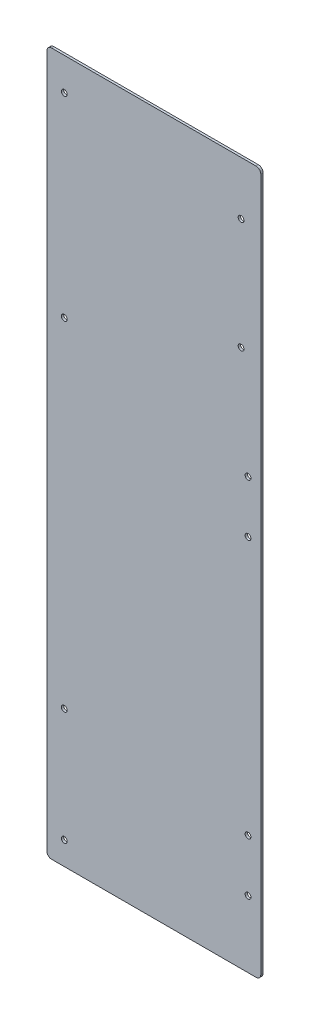
ISO-10303-21;
HEADER;
FILE_DESCRIPTION(('STEP AP214'),'2;1');
FILE_NAME('part.step','',(''),(''),'','','');
FILE_SCHEMA(('AUTOMOTIVE_DESIGN { 1 0 10303 214 1 1 1 1 }'));
ENDSEC;
DATA;
#1=APPLICATION_CONTEXT('core data for automotive mechanical design processes');
#2=APPLICATION_PROTOCOL_DEFINITION('international standard','automotive_design',2000,#1);
#3=PRODUCT_CONTEXT('',#1,'mechanical');
#4=PRODUCT('Part','Part','',(#3));
#5=PRODUCT_RELATED_PRODUCT_CATEGORY('part','',(#4));
#6=PRODUCT_DEFINITION_FORMATION('','',#4);
#7=PRODUCT_DEFINITION_CONTEXT('part definition',#1,'design');
#8=PRODUCT_DEFINITION('design','',#6,#7);
#9=PRODUCT_DEFINITION_SHAPE('','',#8);
#10=(LENGTH_UNIT() NAMED_UNIT(*) SI_UNIT(.MILLI.,.METRE.));
#11=(NAMED_UNIT(*) PLANE_ANGLE_UNIT() SI_UNIT($,.RADIAN.));
#12=(NAMED_UNIT(*) SI_UNIT($,.STERADIAN.) SOLID_ANGLE_UNIT());
#13=UNCERTAINTY_MEASURE_WITH_UNIT(LENGTH_MEASURE(1.E-05),#10,'distance_accuracy_value','');
#14=(GEOMETRIC_REPRESENTATION_CONTEXT(3) GLOBAL_UNCERTAINTY_ASSIGNED_CONTEXT((#13)) GLOBAL_UNIT_ASSIGNED_CONTEXT((#10,
#11,#12)) REPRESENTATION_CONTEXT('',''));
#15=CARTESIAN_POINT('',(0.,0.,0.));
#16=DIRECTION('',(0.,0.,1.));
#17=DIRECTION('',(1.,0.,0.));
#18=AXIS2_PLACEMENT_3D('',#15,#16,#17);
#19=CARTESIAN_POINT('',(20.1603943953535,303.,-0.9999999999998));
#20=DIRECTION('',(0.,1.,0.));
#21=DIRECTION('',(1.,0.,0.));
#22=AXIS2_PLACEMENT_3D('',#19,#20,#21);
#23=PLANE('',#22);
#24=DIRECTION('',(-1.,0.,0.));
#25=VECTOR('',#24,1.);
#26=CARTESIAN_POINT('',(20.1603943953535,303.,-0.9999999999998));
#27=LINE('',#26,#25);
#28=CARTESIAN_POINT('',(71.694686130642,303.,-1.00000000000026));
#29=VERTEX_POINT('',#28);
#30=CARTESIAN_POINT('',(-16.5342917352885,303.,-1.00000000000009));
#31=VERTEX_POINT('',#30);
#32=EDGE_CURVE('E13',#29,#31,#27,.T.);
#33=ORIENTED_EDGE('',*,*,#32,.T.);
#34=DIRECTION('',(0.,0.,1.));
#35=VECTOR('',#34,1.);
#36=CARTESIAN_POINT('',(-16.5342917352885,303.,-1.00000000000009));
#37=LINE('',#36,#35);
#38=CARTESIAN_POINT('',(-16.5342917352885,303.,0.));
#39=VERTEX_POINT('',#38);
#40=EDGE_CURVE('E312',#31,#39,#37,.T.);
#41=ORIENTED_EDGE('',*,*,#40,.T.);
#42=DIRECTION('',(1.,0.,0.));
#43=VECTOR('',#42,1.);
#44=CARTESIAN_POINT('',(20.1603943953535,303.,2.0122792321331E-13));
#45=LINE('',#44,#43);
#46=CARTESIAN_POINT('',(71.694686130642,303.,-2.63677968348475E-13));
#47=VERTEX_POINT('',#46);
#48=EDGE_CURVE('E181',#47,#39,#45,.F.);
#49=ORIENTED_EDGE('',*,*,#48,.F.);
#50=DIRECTION('',(0.,0.,1.));
#51=VECTOR('',#50,1.);
#52=CARTESIAN_POINT('',(71.694686130642,303.,-1.00000000000026));
#53=LINE('',#52,#51);
#54=EDGE_CURVE('E224',#47,#29,#53,.F.);
#55=ORIENTED_EDGE('',*,*,#54,.T.);
#56=EDGE_LOOP('',(#33,#41,#49,#55));
#57=FACE_BOUND('',#56,.T.);
#58=ADVANCED_FACE('F109',(#57),#23,.T.);
#59=CARTESIAN_POINT('',(55.1603943953535,0.,-1.00000000000004));
#60=DIRECTION('',(0.,-1.,0.));
#61=DIRECTION('',(-1.,0.,0.));
#62=AXIS2_PLACEMENT_3D('',#59,#60,#61);
#63=PLANE('',#62);
#64=DIRECTION('',(-1.,0.,0.));
#65=VECTOR('',#64,1.);
#66=CARTESIAN_POINT('',(20.1603943953535,0.,2.0122792321331E-13));
#67=LINE('',#66,#65);
#68=CARTESIAN_POINT('',(-16.5342917352885,0.,0.));
#69=VERTEX_POINT('',#68);
#70=CARTESIAN_POINT('',(71.694686130642,0.,-2.63677968348475E-13));
#71=VERTEX_POINT('',#70);
#72=EDGE_CURVE('E113',#69,#71,#67,.F.);
#73=ORIENTED_EDGE('',*,*,#72,.F.);
#74=DIRECTION('',(0.,0.,1.));
#75=VECTOR('',#74,1.);
#76=CARTESIAN_POINT('',(-16.5342917352885,0.,-1.00000000000009));
#77=LINE('',#76,#75);
#78=CARTESIAN_POINT('',(-16.5342917352885,0.,-1.00000000000009));
#79=VERTEX_POINT('',#78);
#80=EDGE_CURVE('E192',#69,#79,#77,.F.);
#81=ORIENTED_EDGE('',*,*,#80,.T.);
#82=DIRECTION('',(1.,0.,0.));
#83=VECTOR('',#82,1.);
#84=CARTESIAN_POINT('',(55.1603943953535,0.,-1.00000000000004));
#85=LINE('',#84,#83);
#86=CARTESIAN_POINT('',(71.694686130642,0.,-1.00000000000026));
#87=VERTEX_POINT('',#86);
#88=EDGE_CURVE('E120',#79,#87,#85,.T.);
#89=ORIENTED_EDGE('',*,*,#88,.T.);
#90=DIRECTION('',(0.,0.,1.));
#91=VECTOR('',#90,1.);
#92=CARTESIAN_POINT('',(71.694686130642,0.,-1.00000000000026));
#93=LINE('',#92,#91);
#94=EDGE_CURVE('E215',#87,#71,#93,.T.);
#95=ORIENTED_EDGE('',*,*,#94,.T.);
#96=EDGE_LOOP('',(#73,#81,#89,#95));
#97=FACE_BOUND('',#96,.T.);
#98=ADVANCED_FACE('F368',(#97),#63,.T.);
#99=CARTESIAN_POINT('',(20.1603943953535,0.,-0.9999999999998));
#100=DIRECTION('',(0.,0.,-1.));
#101=DIRECTION('',(-1.,0.,0.));
#102=AXIS2_PLACEMENT_3D('',#99,#100,#101);
#103=PLANE('',#102);
#104=ORIENTED_EDGE('',*,*,#88,.F.);
#105=CARTESIAN_POINT('',(-16.5342917352885,2.,-1.00000000000009));
#106=DIRECTION('',(0.,0.,1.));
#107=DIRECTION('',(1.,0.,0.));
#108=AXIS2_PLACEMENT_3D('',#105,#106,#107);
#109=CIRCLE('',#108,2.);
#110=CARTESIAN_POINT('',(-18.5342917352885,2.,-1.00000000000011));
#111=VERTEX_POINT('',#110);
#112=EDGE_CURVE('E165',#79,#111,#109,.F.);
#113=ORIENTED_EDGE('',*,*,#112,.T.);
#114=DIRECTION('',(0.,1.,0.));
#115=VECTOR('',#114,1.);
#116=CARTESIAN_POINT('',(-18.5342917352885,0.,-1.00000000000011));
#117=LINE('',#116,#115);
#118=CARTESIAN_POINT('',(-18.5342917352885,301.,-1.00000000000011));
#119=VERTEX_POINT('',#118);
#120=EDGE_CURVE('E202',#111,#119,#117,.T.);
#121=ORIENTED_EDGE('',*,*,#120,.T.);
#122=CARTESIAN_POINT('',(-16.5342917352885,301.,-1.00000000000009));
#123=DIRECTION('',(0.,0.,1.));
#124=DIRECTION('',(1.,0.,0.));
#125=AXIS2_PLACEMENT_3D('',#122,#123,#124);
#126=CIRCLE('',#125,2.);
#127=EDGE_CURVE('E704',#119,#31,#126,.F.);
#128=ORIENTED_EDGE('',*,*,#127,.T.);
#129=ORIENTED_EDGE('',*,*,#32,.F.);
#130=CARTESIAN_POINT('',(71.694686130642,301.,-1.00000000000026));
#131=DIRECTION('',(0.,0.,1.));
#132=DIRECTION('',(1.,0.,0.));
#133=AXIS2_PLACEMENT_3D('',#130,#131,#132);
#134=CIRCLE('',#133,2.);
#135=CARTESIAN_POINT('',(73.694686130642,301.,-1.00000000000029));
#136=VERTEX_POINT('',#135);
#137=EDGE_CURVE('E235',#29,#136,#134,.F.);
#138=ORIENTED_EDGE('',*,*,#137,.T.);
#139=DIRECTION('',(0.,-1.,0.));
#140=VECTOR('',#139,1.);
#141=CARTESIAN_POINT('',(73.694686130642,0.,-1.00000000000029));
#142=LINE('',#141,#140);
#143=CARTESIAN_POINT('',(73.694686130642,2.,-1.00000000000029));
#144=VERTEX_POINT('',#143);
#145=EDGE_CURVE('E232',#136,#144,#142,.T.);
#146=ORIENTED_EDGE('',*,*,#145,.T.);
#147=CARTESIAN_POINT('',(71.694686130642,2.,-1.00000000000026));
#148=DIRECTION('',(0.,0.,1.));
#149=DIRECTION('',(1.,0.,0.));
#150=AXIS2_PLACEMENT_3D('',#147,#148,#149);
#151=CIRCLE('',#150,2.);
#152=EDGE_CURVE('E228',#144,#87,#151,.F.);
#153=ORIENTED_EDGE('',*,*,#152,.T.);
#154=EDGE_LOOP('',(#104,#113,#121,#128,#129,#138,#146,#153));
#155=FACE_BOUND('',#154,.T.);
#156=CARTESIAN_POINT('',(68.1946861306437,185.249999999993,-1.00000000000036));
#157=DIRECTION('',(0.,0.,-1.));
#158=DIRECTION('',(-1.,0.,0.));
#159=AXIS2_PLACEMENT_3D('',#156,#157,#158);
#160=CIRCLE('',#159,1.25000000000063);
#161=CARTESIAN_POINT('',(66.9446861306431,185.249999999993,-1.00000000000035));
#162=VERTEX_POINT('',#161);
#163=EDGE_CURVE('E238',#162,#162,#160,.T.);
#164=ORIENTED_EDGE('',*,*,#163,.F.);
#165=EDGE_LOOP('',(#164));
#166=FACE_BOUND('',#165,.T.);
#167=CARTESIAN_POINT('',(68.1946861306437,28.7499999999955,-1.00000000000036));
#168=DIRECTION('',(0.,0.,-1.));
#169=DIRECTION('',(-1.,0.,0.));
#170=AXIS2_PLACEMENT_3D('',#167,#168,#169);
#171=CIRCLE('',#170,1.25000000000093);
#172=CARTESIAN_POINT('',(66.9446861306428,28.7499999999955,-1.00000000000035));
#173=VERTEX_POINT('',#172);
#174=EDGE_CURVE('E246',#173,#173,#171,.T.);
#175=ORIENTED_EDGE('',*,*,#174,.F.);
#176=EDGE_LOOP('',(#175));
#177=FACE_BOUND('',#176,.T.);
#178=CARTESIAN_POINT('',(68.1946861306437,51.2499999999955,-1.00000000000036));
#179=DIRECTION('',(0.,0.,-1.));
#180=DIRECTION('',(-1.,0.,0.));
#181=AXIS2_PLACEMENT_3D('',#178,#179,#180);
#182=CIRCLE('',#181,1.25000000000093);
#183=CARTESIAN_POINT('',(66.9446861306428,51.2499999999955,-1.00000000000035));
#184=VERTEX_POINT('',#183);
#185=EDGE_CURVE('E254',#184,#184,#182,.T.);
#186=ORIENTED_EDGE('',*,*,#185,.F.);
#187=EDGE_LOOP('',(#186));
#188=FACE_BOUND('',#187,.T.);
#189=CARTESIAN_POINT('',(68.1946861306437,162.749999999993,-1.00000000000036));
#190=DIRECTION('',(0.,0.,-1.));
#191=DIRECTION('',(-1.,0.,0.));
#192=AXIS2_PLACEMENT_3D('',#189,#190,#191);
#193=CIRCLE('',#192,1.25000000000062);
#194=CARTESIAN_POINT('',(66.9446861306431,162.749999999993,-1.00000000000035));
#195=VERTEX_POINT('',#194);
#196=EDGE_CURVE('E262',#195,#195,#193,.T.);
#197=ORIENTED_EDGE('',*,*,#196,.F.);
#198=EDGE_LOOP('',(#197));
#199=FACE_BOUND('',#198,.T.);
#200=CARTESIAN_POINT('',(65.194686130642,231.999999999992,-1.00000000000034));
#201=DIRECTION('',(0.,0.,-1.));
#202=DIRECTION('',(-1.,0.,0.));
#203=AXIS2_PLACEMENT_3D('',#200,#201,#202);
#204=CIRCLE('',#203,1.25000000000003);
#205=CARTESIAN_POINT('',(63.944686130642,231.999999999992,-1.00000000000033));
#206=VERTEX_POINT('',#205);
#207=EDGE_CURVE('E270',#206,#206,#204,.T.);
#208=ORIENTED_EDGE('',*,*,#207,.F.);
#209=EDGE_LOOP('',(#208));
#210=FACE_BOUND('',#209,.T.);
#211=CARTESIAN_POINT('',(65.194686130642,279.999999999992,-1.00000000000034));
#212=DIRECTION('',(0.,0.,-1.));
#213=DIRECTION('',(-1.,0.,0.));
#214=AXIS2_PLACEMENT_3D('',#211,#212,#213);
#215=CIRCLE('',#214,1.25000000000003);
#216=CARTESIAN_POINT('',(63.944686130642,279.999999999992,-1.00000000000033));
#217=VERTEX_POINT('',#216);
#218=EDGE_CURVE('E278',#217,#217,#215,.T.);
#219=ORIENTED_EDGE('',*,*,#218,.F.);
#220=EDGE_LOOP('',(#219));
#221=FACE_BOUND('',#220,.T.);
#222=CARTESIAN_POINT('',(-11.0342917331599,204.999999999994,-1.00000000000005));
#223=DIRECTION('',(0.,0.,-1.));
#224=DIRECTION('',(-1.,0.,0.));
#225=AXIS2_PLACEMENT_3D('',#222,#223,#224);
#226=CIRCLE('',#225,1.25000000201031);
#227=CARTESIAN_POINT('',(-12.2842917351702,204.999999999994,-1.00000000000006));
#228=VERTEX_POINT('',#227);
#229=EDGE_CURVE('E315',#228,#228,#226,.T.);
#230=ORIENTED_EDGE('',*,*,#229,.F.);
#231=EDGE_LOOP('',(#230));
#232=FACE_BOUND('',#231,.T.);
#233=CARTESIAN_POINT('',(-11.0342917331599,58.9999999999939,-1.00000000000005));
#234=DIRECTION('',(0.,0.,-1.));
#235=DIRECTION('',(-1.,0.,0.));
#236=AXIS2_PLACEMENT_3D('',#233,#234,#235);
#237=CIRCLE('',#236,1.25000000201032);
#238=CARTESIAN_POINT('',(-12.2842917351703,58.9999999999939,-1.00000000000006));
#239=VERTEX_POINT('',#238);
#240=EDGE_CURVE('E330',#239,#239,#237,.T.);
#241=ORIENTED_EDGE('',*,*,#240,.F.);
#242=EDGE_LOOP('',(#241));
#243=FACE_BOUND('',#242,.T.);
#244=CARTESIAN_POINT('',(-11.0342917352785,9.99999999999573,-1.00000000000005));
#245=DIRECTION('',(0.,0.,-1.));
#246=DIRECTION('',(-1.,0.,0.));
#247=AXIS2_PLACEMENT_3D('',#244,#245,#246);
#248=CIRCLE('',#247,1.25000000000132);
#249=CARTESIAN_POINT('',(-12.2842917352798,9.99999999999573,-1.00000000000006));
#250=VERTEX_POINT('',#249);
#251=EDGE_CURVE('E338',#250,#250,#248,.T.);
#252=ORIENTED_EDGE('',*,*,#251,.F.);
#253=EDGE_LOOP('',(#252));
#254=FACE_BOUND('',#253,.T.);
#255=CARTESIAN_POINT('',(-11.0342917352785,288.999999999996,-1.00000000000005));
#256=DIRECTION('',(0.,0.,-1.));
#257=DIRECTION('',(-1.,0.,0.));
#258=AXIS2_PLACEMENT_3D('',#255,#256,#257);
#259=CIRCLE('',#258,1.25000000000133);
#260=CARTESIAN_POINT('',(-12.2842917352798,288.999999999996,-1.00000000000006));
#261=VERTEX_POINT('',#260);
#262=EDGE_CURVE('E346',#261,#261,#259,.T.);
#263=ORIENTED_EDGE('',*,*,#262,.F.);
#264=EDGE_LOOP('',(#263));
#265=FACE_BOUND('',#264,.T.);
#266=ADVANCED_FACE('F360',(#155,#166,#177,#188,#199,#210,#221,#232,#243,#254,#265),#103,.T.);
#267=CARTESIAN_POINT('',(0.,0.,0.));
#268=DIRECTION('',(0.,0.,-1.));
#269=DIRECTION('',(-1.,0.,0.));
#270=AXIS2_PLACEMENT_3D('',#267,#268,#269);
#271=PLANE('',#270);
#272=ORIENTED_EDGE('',*,*,#48,.T.);
#273=CARTESIAN_POINT('',(-16.5342917352885,301.,0.));
#274=DIRECTION('',(0.,0.,1.));
#275=DIRECTION('',(1.,0.,0.));
#276=AXIS2_PLACEMENT_3D('',#273,#274,#275);
#277=CIRCLE('',#276,2.);
#278=CARTESIAN_POINT('',(-18.5342917352885,301.,-1.04950770296597E-13));
#279=VERTEX_POINT('',#278);
#280=EDGE_CURVE('E195',#39,#279,#277,.T.);
#281=ORIENTED_EDGE('',*,*,#280,.T.);
#282=DIRECTION('',(0.,-1.,0.));
#283=VECTOR('',#282,1.);
#284=CARTESIAN_POINT('',(-18.5342917352885,303.,-1.04950770296597E-13));
#285=LINE('',#284,#283);
#286=CARTESIAN_POINT('',(-18.5342917352885,2.,-1.04950770296597E-13));
#287=VERTEX_POINT('',#286);
#288=EDGE_CURVE('E200',#287,#279,#285,.F.);
#289=ORIENTED_EDGE('',*,*,#288,.F.);
#290=CARTESIAN_POINT('',(-16.5342917352885,2.,0.));
#291=DIRECTION('',(0.,0.,1.));
#292=DIRECTION('',(1.,0.,0.));
#293=AXIS2_PLACEMENT_3D('',#290,#291,#292);
#294=CIRCLE('',#293,2.);
#295=EDGE_CURVE('E187',#287,#69,#294,.T.);
#296=ORIENTED_EDGE('',*,*,#295,.T.);
#297=ORIENTED_EDGE('',*,*,#72,.T.);
#298=CARTESIAN_POINT('',(71.694686130642,2.,-2.63677968348475E-13));
#299=DIRECTION('',(0.,0.,1.));
#300=DIRECTION('',(1.,0.,0.));
#301=AXIS2_PLACEMENT_3D('',#298,#299,#300);
#302=CIRCLE('',#301,2.);
#303=CARTESIAN_POINT('',(73.694686130642,2.,-2.91433543964104E-13));
#304=VERTEX_POINT('',#303);
#305=EDGE_CURVE('E129',#71,#304,#302,.T.);
#306=ORIENTED_EDGE('',*,*,#305,.T.);
#307=DIRECTION('',(0.,1.,0.));
#308=VECTOR('',#307,1.);
#309=CARTESIAN_POINT('',(73.694686130642,0.,-2.91433543964104E-13));
#310=LINE('',#309,#308);
#311=CARTESIAN_POINT('',(73.694686130642,301.,-2.91433543964104E-13));
#312=VERTEX_POINT('',#311);
#313=EDGE_CURVE('E288',#312,#304,#310,.F.);
#314=ORIENTED_EDGE('',*,*,#313,.F.);
#315=CARTESIAN_POINT('',(71.694686130642,301.,-2.63677968348475E-13));
#316=DIRECTION('',(0.,0.,1.));
#317=DIRECTION('',(1.,0.,0.));
#318=AXIS2_PLACEMENT_3D('',#315,#316,#317);
#319=CIRCLE('',#318,2.);
#320=EDGE_CURVE('E221',#312,#47,#319,.T.);
#321=ORIENTED_EDGE('',*,*,#320,.T.);
#322=EDGE_LOOP('',(#272,#281,#289,#296,#297,#306,#314,#321));
#323=FACE_BOUND('',#322,.T.);
#324=CARTESIAN_POINT('',(68.1946861306437,185.249999999993,-2.15105711021124E-13));
#325=DIRECTION('',(0.,0.,1.));
#326=DIRECTION('',(1.,0.,0.));
#327=AXIS2_PLACEMENT_3D('',#324,#325,#326);
#328=CIRCLE('',#327,1.25000000000063);
#329=CARTESIAN_POINT('',(69.4446861306443,185.249999999993,-2.32508031748125E-13));
#330=VERTEX_POINT('',#329);
#331=EDGE_CURVE('E242',#330,#330,#328,.T.);
#332=ORIENTED_EDGE('',*,*,#331,.F.);
#333=EDGE_LOOP('',(#332));
#334=FACE_BOUND('',#333,.T.);
#335=CARTESIAN_POINT('',(68.1946861306437,28.7499999999955,-2.15105711021124E-13));
#336=DIRECTION('',(0.,0.,1.));
#337=DIRECTION('',(1.,0.,0.));
#338=AXIS2_PLACEMENT_3D('',#335,#336,#337);
#339=CIRCLE('',#338,1.25000000000093);
#340=CARTESIAN_POINT('',(69.4446861306446,28.7499999999955,-2.32508031748129E-13));
#341=VERTEX_POINT('',#340);
#342=EDGE_CURVE('E250',#341,#341,#339,.T.);
#343=ORIENTED_EDGE('',*,*,#342,.F.);
#344=EDGE_LOOP('',(#343));
#345=FACE_BOUND('',#344,.T.);
#346=CARTESIAN_POINT('',(68.1946861306437,51.2499999999955,-2.15105711021124E-13));
#347=DIRECTION('',(0.,0.,1.));
#348=DIRECTION('',(1.,0.,0.));
#349=AXIS2_PLACEMENT_3D('',#346,#347,#348);
#350=CIRCLE('',#349,1.25000000000093);
#351=CARTESIAN_POINT('',(69.4446861306446,51.2499999999955,-2.32508031748129E-13));
#352=VERTEX_POINT('',#351);
#353=EDGE_CURVE('E258',#352,#352,#350,.T.);
#354=ORIENTED_EDGE('',*,*,#353,.F.);
#355=EDGE_LOOP('',(#354));
#356=FACE_BOUND('',#355,.T.);
#357=CARTESIAN_POINT('',(68.1946861306437,162.749999999993,-2.15105711021124E-13));
#358=DIRECTION('',(0.,0.,1.));
#359=DIRECTION('',(1.,0.,0.));
#360=AXIS2_PLACEMENT_3D('',#357,#358,#359);
#361=CIRCLE('',#360,1.25000000000062);
#362=CARTESIAN_POINT('',(69.4446861306443,162.749999999993,-2.32508031748125E-13));
#363=VERTEX_POINT('',#362);
#364=EDGE_CURVE('E266',#363,#363,#361,.T.);
#365=ORIENTED_EDGE('',*,*,#364,.F.);
#366=EDGE_LOOP('',(#365));
#367=FACE_BOUND('',#366,.T.);
#368=CARTESIAN_POINT('',(65.194686130642,231.999999999992,-1.80411241501588E-13));
#369=DIRECTION('',(0.,0.,1.));
#370=DIRECTION('',(1.,0.,0.));
#371=AXIS2_PLACEMENT_3D('',#368,#369,#370);
#372=CIRCLE('',#371,1.25000000000003);
#373=CARTESIAN_POINT('',(66.444686130642,231.999999999992,-1.9781356222858E-13));
#374=VERTEX_POINT('',#373);
#375=EDGE_CURVE('E274',#374,#374,#372,.T.);
#376=ORIENTED_EDGE('',*,*,#375,.F.);
#377=EDGE_LOOP('',(#376));
#378=FACE_BOUND('',#377,.T.);
#379=CARTESIAN_POINT('',(65.194686130642,279.999999999992,-1.80411241501588E-13));
#380=DIRECTION('',(0.,0.,1.));
#381=DIRECTION('',(1.,0.,0.));
#382=AXIS2_PLACEMENT_3D('',#379,#380,#381);
#383=CIRCLE('',#382,1.25000000000003);
#384=CARTESIAN_POINT('',(66.444686130642,279.999999999992,-1.9781356222858E-13));
#385=VERTEX_POINT('',#384);
#386=EDGE_CURVE('E282',#385,#385,#383,.T.);
#387=ORIENTED_EDGE('',*,*,#386,.F.);
#388=EDGE_LOOP('',(#387));
#389=FACE_BOUND('',#388,.T.);
#390=CARTESIAN_POINT('',(-11.0342917331599,204.999999999994,0.));
#391=DIRECTION('',(0.,0.,1.));
#392=DIRECTION('',(1.,0.,0.));
#393=AXIS2_PLACEMENT_3D('',#390,#391,#392);
#394=CIRCLE('',#393,1.25000000201031);
#395=CARTESIAN_POINT('',(-9.78429173114959,204.999999999994,0.));
#396=VERTEX_POINT('',#395);
#397=EDGE_CURVE('E324',#396,#396,#394,.T.);
#398=ORIENTED_EDGE('',*,*,#397,.F.);
#399=EDGE_LOOP('',(#398));
#400=FACE_BOUND('',#399,.T.);
#401=CARTESIAN_POINT('',(-11.03429173316,58.9999999999939,0.));
#402=DIRECTION('',(0.,0.,1.));
#403=DIRECTION('',(1.,0.,0.));
#404=AXIS2_PLACEMENT_3D('',#401,#402,#403);
#405=CIRCLE('',#404,1.25000000201032);
#406=CARTESIAN_POINT('',(-9.78429173114963,58.9999999999939,0.));
#407=VERTEX_POINT('',#406);
#408=EDGE_CURVE('E334',#407,#407,#405,.T.);
#409=ORIENTED_EDGE('',*,*,#408,.F.);
#410=EDGE_LOOP('',(#409));
#411=FACE_BOUND('',#410,.T.);
#412=CARTESIAN_POINT('',(-11.0342917352785,9.99999999999573,0.));
#413=DIRECTION('',(0.,0.,1.));
#414=DIRECTION('',(1.,0.,0.));
#415=AXIS2_PLACEMENT_3D('',#412,#413,#414);
#416=CIRCLE('',#415,1.25000000000132);
#417=CARTESIAN_POINT('',(-9.78429173527713,9.99999999999573,0.));
#418=VERTEX_POINT('',#417);
#419=EDGE_CURVE('E342',#418,#418,#416,.T.);
#420=ORIENTED_EDGE('',*,*,#419,.F.);
#421=EDGE_LOOP('',(#420));
#422=FACE_BOUND('',#421,.T.);
#423=CARTESIAN_POINT('',(-11.0342917352785,288.999999999996,0.));
#424=DIRECTION('',(0.,0.,1.));
#425=DIRECTION('',(1.,0.,0.));
#426=AXIS2_PLACEMENT_3D('',#423,#424,#425);
#427=CIRCLE('',#426,1.25000000000133);
#428=CARTESIAN_POINT('',(-9.78429173527714,288.999999999996,0.));
#429=VERTEX_POINT('',#428);
#430=EDGE_CURVE('E204',#429,#429,#427,.T.);
#431=ORIENTED_EDGE('',*,*,#430,.F.);
#432=EDGE_LOOP('',(#431));
#433=FACE_BOUND('',#432,.T.);
#434=ADVANCED_FACE('F111',(#323,#334,#345,#356,#367,#378,#389,#400,#411,#422,#433),#271,.F.);
#435=CARTESIAN_POINT('',(71.694686130642,2.,-1.00000000000026));
#436=DIRECTION('',(0.,0.,1.));
#437=DIRECTION('',(1.,0.,0.));
#438=AXIS2_PLACEMENT_3D('',#435,#436,#437);
#439=CYLINDRICAL_SURFACE('',#438,2.);
#440=ORIENTED_EDGE('',*,*,#152,.F.);
#441=DIRECTION('',(0.,0.,1.));
#442=VECTOR('',#441,1.);
#443=CARTESIAN_POINT('',(73.694686130642,2.,-1.00000000000029));
#444=LINE('',#443,#442);
#445=EDGE_CURVE('E153',#304,#144,#444,.F.);
#446=ORIENTED_EDGE('',*,*,#445,.F.);
#447=ORIENTED_EDGE('',*,*,#305,.F.);
#448=ORIENTED_EDGE('',*,*,#94,.F.);
#449=EDGE_LOOP('',(#440,#446,#447,#448));
#450=FACE_BOUND('',#449,.T.);
#451=ADVANCED_FACE('F359',(#450),#439,.T.);
#452=CARTESIAN_POINT('',(73.694686130642,0.,-1.00000000000029));
#453=DIRECTION('',(-1.,0.,0.));
#454=DIRECTION('',(0.,0.,1.));
#455=AXIS2_PLACEMENT_3D('',#452,#453,#454);
#456=PLANE('',#455);
#457=ORIENTED_EDGE('',*,*,#145,.F.);
#458=DIRECTION('',(0.,0.,1.));
#459=VECTOR('',#458,1.);
#460=CARTESIAN_POINT('',(73.694686130642,301.,-1.00000000000029));
#461=LINE('',#460,#459);
#462=EDGE_CURVE('E291',#136,#312,#461,.T.);
#463=ORIENTED_EDGE('',*,*,#462,.T.);
#464=ORIENTED_EDGE('',*,*,#313,.T.);
#465=ORIENTED_EDGE('',*,*,#445,.T.);
#466=EDGE_LOOP('',(#457,#463,#464,#465));
#467=FACE_BOUND('',#466,.T.);
#468=ADVANCED_FACE('F365',(#467),#456,.F.);
#469=CARTESIAN_POINT('',(71.694686130642,301.,-1.00000000000026));
#470=DIRECTION('',(0.,0.,1.));
#471=DIRECTION('',(1.,0.,0.));
#472=AXIS2_PLACEMENT_3D('',#469,#470,#471);
#473=CYLINDRICAL_SURFACE('',#472,2.);
#474=ORIENTED_EDGE('',*,*,#137,.F.);
#475=ORIENTED_EDGE('',*,*,#54,.F.);
#476=ORIENTED_EDGE('',*,*,#320,.F.);
#477=ORIENTED_EDGE('',*,*,#462,.F.);
#478=EDGE_LOOP('',(#474,#475,#476,#477));
#479=FACE_BOUND('',#478,.T.);
#480=ADVANCED_FACE('F400',(#479),#473,.T.);
#481=CARTESIAN_POINT('',(65.1946861306421,279.999999999992,8.99999999999966));
#482=DIRECTION('',(0.,0.,-1.));
#483=DIRECTION('',(-1.,0.,0.));
#484=AXIS2_PLACEMENT_3D('',#481,#482,#483);
#485=CYLINDRICAL_SURFACE('',#484,1.25000000000003);
#486=ORIENTED_EDGE('',*,*,#386,.T.);
#487=EDGE_LOOP('',(#486));
#488=FACE_BOUND('',#487,.T.);
#489=ORIENTED_EDGE('',*,*,#218,.T.);
#490=EDGE_LOOP('',(#489));
#491=FACE_BOUND('',#490,.T.);
#492=ADVANCED_FACE('F396',(#488,#491),#485,.F.);
#493=CARTESIAN_POINT('',(65.1946861306421,231.999999999992,8.99999999999966));
#494=DIRECTION('',(0.,0.,-1.));
#495=DIRECTION('',(-1.,0.,0.));
#496=AXIS2_PLACEMENT_3D('',#493,#494,#495);
#497=CYLINDRICAL_SURFACE('',#496,1.25000000000003);
#498=ORIENTED_EDGE('',*,*,#375,.T.);
#499=EDGE_LOOP('',(#498));
#500=FACE_BOUND('',#499,.T.);
#501=ORIENTED_EDGE('',*,*,#207,.T.);
#502=EDGE_LOOP('',(#501));
#503=FACE_BOUND('',#502,.T.);
#504=ADVANCED_FACE('F392',(#500,#503),#497,.F.);
#505=CARTESIAN_POINT('',(68.1946861306438,162.749999999993,8.99999999999964));
#506=DIRECTION('',(0.,0.,-1.));
#507=DIRECTION('',(-1.,0.,0.));
#508=AXIS2_PLACEMENT_3D('',#505,#506,#507);
#509=CYLINDRICAL_SURFACE('',#508,1.25000000000062);
#510=ORIENTED_EDGE('',*,*,#364,.T.);
#511=EDGE_LOOP('',(#510));
#512=FACE_BOUND('',#511,.T.);
#513=ORIENTED_EDGE('',*,*,#196,.T.);
#514=EDGE_LOOP('',(#513));
#515=FACE_BOUND('',#514,.T.);
#516=ADVANCED_FACE('F388',(#512,#515),#509,.F.);
#517=CARTESIAN_POINT('',(68.1946861306438,51.2499999999955,8.99999999999964));
#518=DIRECTION('',(0.,0.,-1.));
#519=DIRECTION('',(-1.,0.,0.));
#520=AXIS2_PLACEMENT_3D('',#517,#518,#519);
#521=CYLINDRICAL_SURFACE('',#520,1.25000000000093);
#522=ORIENTED_EDGE('',*,*,#353,.T.);
#523=EDGE_LOOP('',(#522));
#524=FACE_BOUND('',#523,.T.);
#525=ORIENTED_EDGE('',*,*,#185,.T.);
#526=EDGE_LOOP('',(#525));
#527=FACE_BOUND('',#526,.T.);
#528=ADVANCED_FACE('F384',(#524,#527),#521,.F.);
#529=CARTESIAN_POINT('',(68.1946861306438,28.7499999999955,8.99999999999964));
#530=DIRECTION('',(0.,0.,-1.));
#531=DIRECTION('',(-1.,0.,0.));
#532=AXIS2_PLACEMENT_3D('',#529,#530,#531);
#533=CYLINDRICAL_SURFACE('',#532,1.25000000000093);
#534=ORIENTED_EDGE('',*,*,#342,.T.);
#535=EDGE_LOOP('',(#534));
#536=FACE_BOUND('',#535,.T.);
#537=ORIENTED_EDGE('',*,*,#174,.T.);
#538=EDGE_LOOP('',(#537));
#539=FACE_BOUND('',#538,.T.);
#540=ADVANCED_FACE('F380',(#536,#539),#533,.F.);
#541=CARTESIAN_POINT('',(68.1946861306438,185.249999999993,8.99999999999964));
#542=DIRECTION('',(0.,0.,-1.));
#543=DIRECTION('',(-1.,0.,0.));
#544=AXIS2_PLACEMENT_3D('',#541,#542,#543);
#545=CYLINDRICAL_SURFACE('',#544,1.25000000000063);
#546=ORIENTED_EDGE('',*,*,#331,.T.);
#547=EDGE_LOOP('',(#546));
#548=FACE_BOUND('',#547,.T.);
#549=ORIENTED_EDGE('',*,*,#163,.T.);
#550=EDGE_LOOP('',(#549));
#551=FACE_BOUND('',#550,.T.);
#552=ADVANCED_FACE('F377',(#548,#551),#545,.F.);
#553=CARTESIAN_POINT('',(-16.5342917352885,2.,-1.00000000000009));
#554=DIRECTION('',(0.,0.,1.));
#555=DIRECTION('',(1.,0.,0.));
#556=AXIS2_PLACEMENT_3D('',#553,#554,#555);
#557=CYLINDRICAL_SURFACE('',#556,2.);
#558=ORIENTED_EDGE('',*,*,#112,.F.);
#559=ORIENTED_EDGE('',*,*,#80,.F.);
#560=ORIENTED_EDGE('',*,*,#295,.F.);
#561=DIRECTION('',(0.,0.,1.));
#562=VECTOR('',#561,1.);
#563=CARTESIAN_POINT('',(-18.5342917352885,2.,-1.00000000000011));
#564=LINE('',#563,#562);
#565=EDGE_CURVE('E190',#111,#287,#564,.T.);
#566=ORIENTED_EDGE('',*,*,#565,.F.);
#567=EDGE_LOOP('',(#558,#559,#560,#566));
#568=FACE_BOUND('',#567,.T.);
#569=ADVANCED_FACE('F189',(#568),#557,.T.);
#570=CARTESIAN_POINT('',(-16.5342917352885,301.,-1.00000000000009));
#571=DIRECTION('',(0.,0.,1.));
#572=DIRECTION('',(1.,0.,0.));
#573=AXIS2_PLACEMENT_3D('',#570,#571,#572);
#574=CYLINDRICAL_SURFACE('',#573,2.);
#575=ORIENTED_EDGE('',*,*,#127,.F.);
#576=DIRECTION('',(0.,0.,1.));
#577=VECTOR('',#576,1.);
#578=CARTESIAN_POINT('',(-18.5342917352885,301.,-1.00000000000011));
#579=LINE('',#578,#577);
#580=EDGE_CURVE('E205',#279,#119,#579,.F.);
#581=ORIENTED_EDGE('',*,*,#580,.F.);
#582=ORIENTED_EDGE('',*,*,#280,.F.);
#583=ORIENTED_EDGE('',*,*,#40,.F.);
#584=EDGE_LOOP('',(#575,#581,#582,#583));
#585=FACE_BOUND('',#584,.T.);
#586=ADVANCED_FACE('F423',(#585),#574,.T.);
#587=CARTESIAN_POINT('',(-18.5342917352885,303.,-1.00000000000011));
#588=DIRECTION('',(1.,0.,0.));
#589=DIRECTION('',(0.,0.,-1.));
#590=AXIS2_PLACEMENT_3D('',#587,#588,#589);
#591=PLANE('',#590);
#592=ORIENTED_EDGE('',*,*,#288,.T.);
#593=ORIENTED_EDGE('',*,*,#580,.T.);
#594=ORIENTED_EDGE('',*,*,#120,.F.);
#595=ORIENTED_EDGE('',*,*,#565,.T.);
#596=EDGE_LOOP('',(#592,#593,#594,#595));
#597=FACE_BOUND('',#596,.T.);
#598=ADVANCED_FACE('F199',(#597),#591,.F.);
#599=CARTESIAN_POINT('',(-11.0342917352785,288.999999999996,8.99999999999995));
#600=DIRECTION('',(0.,0.,-1.));
#601=DIRECTION('',(-1.,0.,0.));
#602=AXIS2_PLACEMENT_3D('',#599,#600,#601);
#603=CYLINDRICAL_SURFACE('',#602,1.25000000000133);
#604=ORIENTED_EDGE('',*,*,#430,.T.);
#605=EDGE_LOOP('',(#604));
#606=FACE_BOUND('',#605,.T.);
#607=ORIENTED_EDGE('',*,*,#262,.T.);
#608=EDGE_LOOP('',(#607));
#609=FACE_BOUND('',#608,.T.);
#610=ADVANCED_FACE('F355',(#606,#609),#603,.F.);
#611=CARTESIAN_POINT('',(-11.0342917352785,9.99999999999573,8.99999999999995));
#612=DIRECTION('',(0.,0.,-1.));
#613=DIRECTION('',(-1.,0.,0.));
#614=AXIS2_PLACEMENT_3D('',#611,#612,#613);
#615=CYLINDRICAL_SURFACE('',#614,1.25000000000132);
#616=ORIENTED_EDGE('',*,*,#419,.T.);
#617=EDGE_LOOP('',(#616));
#618=FACE_BOUND('',#617,.T.);
#619=ORIENTED_EDGE('',*,*,#251,.T.);
#620=EDGE_LOOP('',(#619));
#621=FACE_BOUND('',#620,.T.);
#622=ADVANCED_FACE('F414',(#618,#621),#615,.F.);
#623=CARTESIAN_POINT('',(-11.03429173316,58.9999999999939,0.999999999999948));
#624=DIRECTION('',(0.,0.,-1.));
#625=DIRECTION('',(-1.,0.,0.));
#626=AXIS2_PLACEMENT_3D('',#623,#624,#625);
#627=CYLINDRICAL_SURFACE('',#626,1.25000000201032);
#628=ORIENTED_EDGE('',*,*,#408,.T.);
#629=EDGE_LOOP('',(#628));
#630=FACE_BOUND('',#629,.T.);
#631=ORIENTED_EDGE('',*,*,#240,.T.);
#632=EDGE_LOOP('',(#631));
#633=FACE_BOUND('',#632,.T.);
#634=ADVANCED_FACE('F410',(#630,#633),#627,.F.);
#635=CARTESIAN_POINT('',(-11.0342917331599,204.999999999994,0.999999999999948));
#636=DIRECTION('',(0.,0.,-1.));
#637=DIRECTION('',(-1.,0.,0.));
#638=AXIS2_PLACEMENT_3D('',#635,#636,#637);
#639=CYLINDRICAL_SURFACE('',#638,1.25000000201031);
#640=ORIENTED_EDGE('',*,*,#397,.T.);
#641=EDGE_LOOP('',(#640));
#642=FACE_BOUND('',#641,.T.);
#643=ORIENTED_EDGE('',*,*,#229,.T.);
#644=EDGE_LOOP('',(#643));
#645=FACE_BOUND('',#644,.T.);
#646=ADVANCED_FACE('F407',(#642,#645),#639,.F.);
#647=CLOSED_SHELL('',(#58,#98,#266,#434,#451,#468,#480,#492,#504,#516,#528,#540,#552,#569,#586,
#598,#610,#622,#634,#646));
#648=MANIFOLD_SOLID_BREP('B2',#647);
#649=ADVANCED_BREP_SHAPE_REPRESENTATION('',(#18,#648),#14);
#650=SHAPE_DEFINITION_REPRESENTATION(#9,#649);
ENDSEC;
END-ISO-10303-21;
